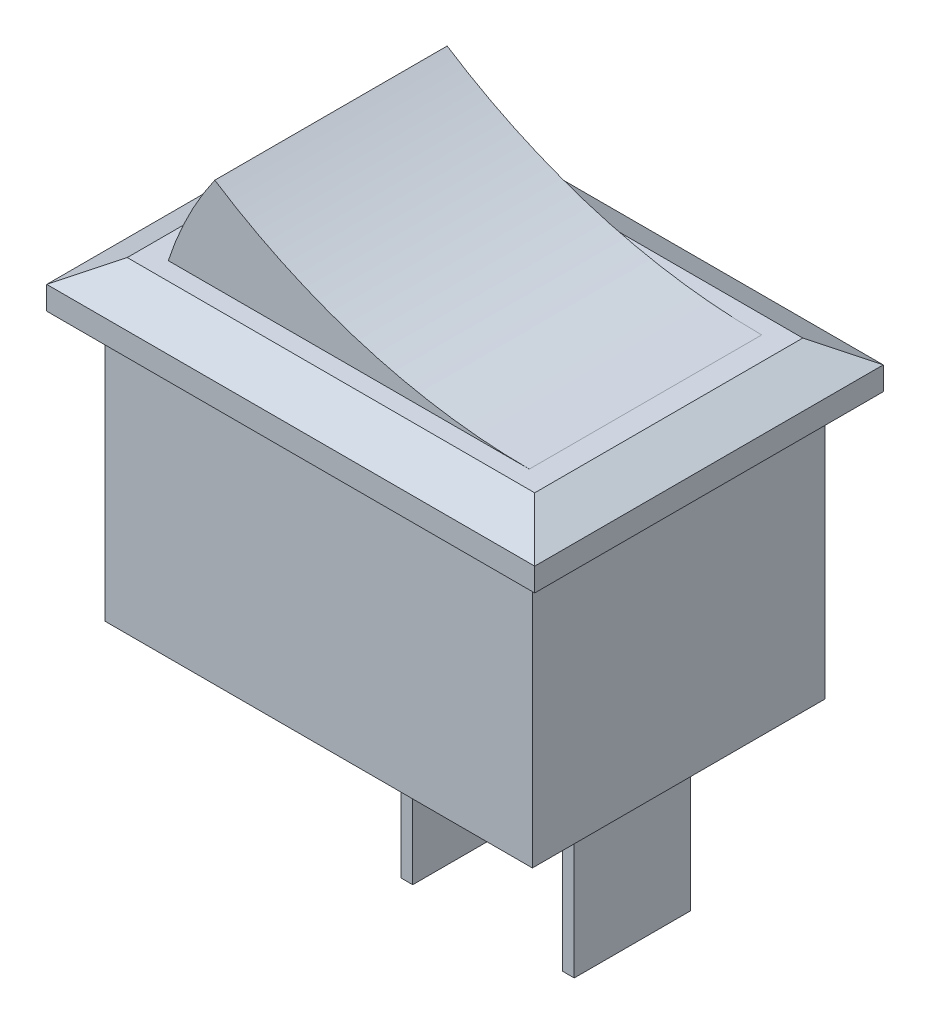
ISO-10303-21;
HEADER;
FILE_DESCRIPTION(('STEP AP214'),'2;1');
FILE_NAME('part.step','',(''),(''),'','','');
FILE_SCHEMA(('AUTOMOTIVE_DESIGN { 1 0 10303 214 1 1 1 1 }'));
ENDSEC;
DATA;
#1=APPLICATION_CONTEXT('core data for automotive mechanical design processes');
#2=APPLICATION_PROTOCOL_DEFINITION('international standard','automotive_design',2000,#1);
#3=PRODUCT_CONTEXT('',#1,'mechanical');
#4=PRODUCT('Part','Part','',(#3));
#5=PRODUCT_RELATED_PRODUCT_CATEGORY('part','',(#4));
#6=PRODUCT_DEFINITION_FORMATION('','',#4);
#7=PRODUCT_DEFINITION_CONTEXT('part definition',#1,'design');
#8=PRODUCT_DEFINITION('design','',#6,#7);
#9=PRODUCT_DEFINITION_SHAPE('','',#8);
#10=(LENGTH_UNIT() NAMED_UNIT(*) SI_UNIT(.MILLI.,.METRE.));
#11=(NAMED_UNIT(*) PLANE_ANGLE_UNIT() SI_UNIT($,.RADIAN.));
#12=(NAMED_UNIT(*) SI_UNIT($,.STERADIAN.) SOLID_ANGLE_UNIT());
#13=UNCERTAINTY_MEASURE_WITH_UNIT(LENGTH_MEASURE(1.E-05),#10,'distance_accuracy_value','');
#14=(GEOMETRIC_REPRESENTATION_CONTEXT(3) GLOBAL_UNCERTAINTY_ASSIGNED_CONTEXT((#13)) GLOBAL_UNIT_ASSIGNED_CONTEXT((#10,
#11,#12)) REPRESENTATION_CONTEXT('',''));
#15=CARTESIAN_POINT('',(0.,0.,0.));
#16=DIRECTION('',(0.,0.,1.));
#17=DIRECTION('',(1.,0.,0.));
#18=AXIS2_PLACEMENT_3D('',#15,#16,#17);
#19=CARTESIAN_POINT('',(6.7,-18.5,2.5));
#20=DIRECTION('',(1.,0.,0.));
#21=DIRECTION('',(0.,0.,-1.));
#22=AXIS2_PLACEMENT_3D('',#19,#20,#21);
#23=PLANE('',#22);
#24=DIRECTION('',(0.,0.,-1.));
#25=VECTOR('',#24,1.);
#26=CARTESIAN_POINT('',(6.7,-11.5,2.5));
#27=LINE('',#26,#25);
#28=CARTESIAN_POINT('',(6.7,-11.5,2.5));
#29=VERTEX_POINT('',#28);
#30=CARTESIAN_POINT('',(6.7,-11.5,-2.5));
#31=VERTEX_POINT('',#30);
#32=EDGE_CURVE('E12',#29,#31,#27,.T.);
#33=ORIENTED_EDGE('',*,*,#32,.T.);
#34=DIRECTION('',(0.,1.,0.));
#35=VECTOR('',#34,1.);
#36=CARTESIAN_POINT('',(6.7,-18.5,-2.5));
#37=LINE('',#36,#35);
#38=CARTESIAN_POINT('',(6.7,-18.5,-2.5));
#39=VERTEX_POINT('',#38);
#40=EDGE_CURVE('E128',#39,#31,#37,.T.);
#41=ORIENTED_EDGE('',*,*,#40,.F.);
#42=DIRECTION('',(0.,0.,-1.));
#43=VECTOR('',#42,1.);
#44=CARTESIAN_POINT('',(6.7,-18.5,2.5));
#45=LINE('',#44,#43);
#46=CARTESIAN_POINT('',(6.7,-18.5,2.5));
#47=VERTEX_POINT('',#46);
#48=EDGE_CURVE('E61',#47,#39,#45,.T.);
#49=ORIENTED_EDGE('',*,*,#48,.F.);
#50=DIRECTION('',(0.,1.,0.));
#51=VECTOR('',#50,1.);
#52=CARTESIAN_POINT('',(6.7,-18.5,2.5));
#53=LINE('',#52,#51);
#54=EDGE_CURVE('E116',#47,#29,#53,.T.);
#55=ORIENTED_EDGE('',*,*,#54,.T.);
#56=EDGE_LOOP('',(#33,#41,#49,#55));
#57=FACE_BOUND('',#56,.T.);
#58=ADVANCED_FACE('F57',(#57),#23,.F.);
#59=CARTESIAN_POINT('',(6.7,-18.5,-2.5));
#60=DIRECTION('',(0.,0.,1.));
#61=DIRECTION('',(1.,0.,0.));
#62=AXIS2_PLACEMENT_3D('',#59,#60,#61);
#63=PLANE('',#62);
#64=DIRECTION('',(1.,0.,0.));
#65=VECTOR('',#64,1.);
#66=CARTESIAN_POINT('',(6.7,-11.5,-2.5));
#67=LINE('',#66,#65);
#68=CARTESIAN_POINT('',(7.2,-11.5,-2.5));
#69=VERTEX_POINT('',#68);
#70=EDGE_CURVE('E67',#31,#69,#67,.T.);
#71=ORIENTED_EDGE('',*,*,#70,.T.);
#72=DIRECTION('',(0.,1.,0.));
#73=VECTOR('',#72,1.);
#74=CARTESIAN_POINT('',(7.2,-18.5,-2.5));
#75=LINE('',#74,#73);
#76=CARTESIAN_POINT('',(7.2,-18.5,-2.5));
#77=VERTEX_POINT('',#76);
#78=EDGE_CURVE('E112',#77,#69,#75,.T.);
#79=ORIENTED_EDGE('',*,*,#78,.F.);
#80=DIRECTION('',(1.,0.,0.));
#81=VECTOR('',#80,1.);
#82=CARTESIAN_POINT('',(6.7,-18.5,-2.5));
#83=LINE('',#82,#81);
#84=EDGE_CURVE('E91',#39,#77,#83,.T.);
#85=ORIENTED_EDGE('',*,*,#84,.F.);
#86=ORIENTED_EDGE('',*,*,#40,.T.);
#87=EDGE_LOOP('',(#71,#79,#85,#86));
#88=FACE_BOUND('',#87,.T.);
#89=ADVANCED_FACE('F131',(#88),#63,.F.);
#90=CARTESIAN_POINT('',(7.2,-18.5,2.5));
#91=DIRECTION('',(-1.,0.,0.));
#92=DIRECTION('',(0.,0.,1.));
#93=AXIS2_PLACEMENT_3D('',#90,#91,#92);
#94=PLANE('',#93);
#95=DIRECTION('',(0.,0.,1.));
#96=VECTOR('',#95,1.);
#97=CARTESIAN_POINT('',(7.2,-11.5,2.5));
#98=LINE('',#97,#96);
#99=CARTESIAN_POINT('',(7.2,-11.5,2.5));
#100=VERTEX_POINT('',#99);
#101=EDGE_CURVE('E107',#69,#100,#98,.T.);
#102=ORIENTED_EDGE('',*,*,#101,.T.);
#103=DIRECTION('',(0.,1.,0.));
#104=VECTOR('',#103,1.);
#105=CARTESIAN_POINT('',(7.2,-18.5,2.5));
#106=LINE('',#105,#104);
#107=CARTESIAN_POINT('',(7.2,-18.5,2.5));
#108=VERTEX_POINT('',#107);
#109=EDGE_CURVE('E110',#108,#100,#106,.T.);
#110=ORIENTED_EDGE('',*,*,#109,.F.);
#111=DIRECTION('',(0.,0.,1.));
#112=VECTOR('',#111,1.);
#113=CARTESIAN_POINT('',(7.2,-18.5,2.5));
#114=LINE('',#113,#112);
#115=EDGE_CURVE('E124',#77,#108,#114,.T.);
#116=ORIENTED_EDGE('',*,*,#115,.F.);
#117=ORIENTED_EDGE('',*,*,#78,.T.);
#118=EDGE_LOOP('',(#102,#110,#116,#117));
#119=FACE_BOUND('',#118,.T.);
#120=ADVANCED_FACE('F108',(#119),#94,.F.);
#121=CARTESIAN_POINT('',(6.7,-18.5,2.5));
#122=DIRECTION('',(0.,0.,-1.));
#123=DIRECTION('',(-1.,0.,0.));
#124=AXIS2_PLACEMENT_3D('',#121,#122,#123);
#125=PLANE('',#124);
#126=DIRECTION('',(-1.,0.,0.));
#127=VECTOR('',#126,1.);
#128=CARTESIAN_POINT('',(6.7,-11.5,2.5));
#129=LINE('',#128,#127);
#130=EDGE_CURVE('E101',#100,#29,#129,.T.);
#131=ORIENTED_EDGE('',*,*,#130,.T.);
#132=ORIENTED_EDGE('',*,*,#54,.F.);
#133=DIRECTION('',(-1.,0.,0.));
#134=VECTOR('',#133,1.);
#135=CARTESIAN_POINT('',(6.7,-18.5,2.5));
#136=LINE('',#135,#134);
#137=EDGE_CURVE('E115',#108,#47,#136,.T.);
#138=ORIENTED_EDGE('',*,*,#137,.F.);
#139=ORIENTED_EDGE('',*,*,#109,.T.);
#140=EDGE_LOOP('',(#131,#132,#138,#139));
#141=FACE_BOUND('',#140,.T.);
#142=ADVANCED_FACE('F114',(#141),#125,.F.);
#143=CARTESIAN_POINT('',(0.,-18.5,0.));
#144=DIRECTION('',(0.,-1.,0.));
#145=DIRECTION('',(0.,0.,-1.));
#146=AXIS2_PLACEMENT_3D('',#143,#144,#145);
#147=PLANE('',#146);
#148=ORIENTED_EDGE('',*,*,#48,.T.);
#149=ORIENTED_EDGE('',*,*,#84,.T.);
#150=ORIENTED_EDGE('',*,*,#115,.T.);
#151=ORIENTED_EDGE('',*,*,#137,.T.);
#152=EDGE_LOOP('',(#148,#149,#150,#151));
#153=FACE_BOUND('',#152,.T.);
#154=ADVANCED_FACE('F59',(#153),#147,.T.);
#155=CARTESIAN_POINT('',(0.,-11.5,0.));
#156=DIRECTION('',(0.,-1.,0.));
#157=DIRECTION('',(0.,0.,-1.));
#158=AXIS2_PLACEMENT_3D('',#155,#156,#157);
#159=PLANE('',#158);
#160=ORIENTED_EDGE('',*,*,#32,.F.);
#161=ORIENTED_EDGE('',*,*,#130,.F.);
#162=ORIENTED_EDGE('',*,*,#101,.F.);
#163=ORIENTED_EDGE('',*,*,#70,.F.);
#164=EDGE_LOOP('',(#160,#161,#162,#163));
#165=FACE_BOUND('',#164,.T.);
#166=ADVANCED_FACE('F118',(#165),#159,.F.);
#167=CLOSED_SHELL('',(#58,#89,#120,#142,#154,#166));
#168=MANIFOLD_SOLID_BREP('B2',#167);
#169=CARTESIAN_POINT('',(0.25,-18.5,-2.5));
#170=DIRECTION('',(-1.,0.,0.));
#171=DIRECTION('',(0.,0.,1.));
#172=AXIS2_PLACEMENT_3D('',#169,#170,#171);
#173=PLANE('',#172);
#174=DIRECTION('',(0.,0.,1.));
#175=VECTOR('',#174,1.);
#176=CARTESIAN_POINT('',(0.25,-11.5,-2.5));
#177=LINE('',#176,#175);
#178=CARTESIAN_POINT('',(0.25,-11.5,-2.5));
#179=VERTEX_POINT('',#178);
#180=CARTESIAN_POINT('',(0.25,-11.5,2.5));
#181=VERTEX_POINT('',#180);
#182=EDGE_CURVE('E265',#179,#181,#177,.T.);
#183=ORIENTED_EDGE('',*,*,#182,.T.);
#184=DIRECTION('',(0.,1.,0.));
#185=VECTOR('',#184,1.);
#186=CARTESIAN_POINT('',(0.25,-18.5,2.5));
#187=LINE('',#186,#185);
#188=CARTESIAN_POINT('',(0.25,-18.5,2.5));
#189=VERTEX_POINT('',#188);
#190=EDGE_CURVE('E55',#189,#181,#187,.T.);
#191=ORIENTED_EDGE('',*,*,#190,.F.);
#192=DIRECTION('',(0.,0.,1.));
#193=VECTOR('',#192,1.);
#194=CARTESIAN_POINT('',(0.25,-18.5,-2.5));
#195=LINE('',#194,#193);
#196=CARTESIAN_POINT('',(0.25,-18.5,-2.5));
#197=VERTEX_POINT('',#196);
#198=EDGE_CURVE('E253',#197,#189,#195,.T.);
#199=ORIENTED_EDGE('',*,*,#198,.F.);
#200=DIRECTION('',(0.,1.,0.));
#201=VECTOR('',#200,1.);
#202=CARTESIAN_POINT('',(0.25,-18.5,-2.5));
#203=LINE('',#202,#201);
#204=EDGE_CURVE('E261',#197,#179,#203,.T.);
#205=ORIENTED_EDGE('',*,*,#204,.T.);
#206=EDGE_LOOP('',(#183,#191,#199,#205));
#207=FACE_BOUND('',#206,.T.);
#208=ADVANCED_FACE('F202',(#207),#173,.F.);
#209=CARTESIAN_POINT('',(0.25,-18.5,2.5));
#210=DIRECTION('',(0.,0.,-1.));
#211=DIRECTION('',(-1.,0.,0.));
#212=AXIS2_PLACEMENT_3D('',#209,#210,#211);
#213=PLANE('',#212);
#214=DIRECTION('',(-1.,0.,0.));
#215=VECTOR('',#214,1.);
#216=CARTESIAN_POINT('',(0.25,-11.5,2.5));
#217=LINE('',#216,#215);
#218=CARTESIAN_POINT('',(-0.25,-11.5,2.5));
#219=VERTEX_POINT('',#218);
#220=EDGE_CURVE('E257',#181,#219,#217,.T.);
#221=ORIENTED_EDGE('',*,*,#220,.T.);
#222=DIRECTION('',(0.,1.,0.));
#223=VECTOR('',#222,1.);
#224=CARTESIAN_POINT('',(-0.25,-18.5,2.5));
#225=LINE('',#224,#223);
#226=CARTESIAN_POINT('',(-0.25,-18.5,2.5));
#227=VERTEX_POINT('',#226);
#228=EDGE_CURVE('E210',#227,#219,#225,.T.);
#229=ORIENTED_EDGE('',*,*,#228,.F.);
#230=DIRECTION('',(-1.,0.,0.));
#231=VECTOR('',#230,1.);
#232=CARTESIAN_POINT('',(0.25,-18.5,2.5));
#233=LINE('',#232,#231);
#234=EDGE_CURVE('E248',#189,#227,#233,.T.);
#235=ORIENTED_EDGE('',*,*,#234,.F.);
#236=ORIENTED_EDGE('',*,*,#190,.T.);
#237=EDGE_LOOP('',(#221,#229,#235,#236));
#238=FACE_BOUND('',#237,.T.);
#239=ADVANCED_FACE('F256',(#238),#213,.F.);
#240=CARTESIAN_POINT('',(-0.25,-18.5,-2.5));
#241=DIRECTION('',(1.,0.,0.));
#242=DIRECTION('',(0.,0.,-1.));
#243=AXIS2_PLACEMENT_3D('',#240,#241,#242);
#244=PLANE('',#243);
#245=DIRECTION('',(0.,0.,-1.));
#246=VECTOR('',#245,1.);
#247=CARTESIAN_POINT('',(-0.25,-11.5,-2.5));
#248=LINE('',#247,#246);
#249=CARTESIAN_POINT('',(-0.25,-11.5,-2.5));
#250=VERTEX_POINT('',#249);
#251=EDGE_CURVE('E235',#219,#250,#248,.T.);
#252=ORIENTED_EDGE('',*,*,#251,.T.);
#253=DIRECTION('',(0.,1.,0.));
#254=VECTOR('',#253,1.);
#255=CARTESIAN_POINT('',(-0.25,-18.5,-2.5));
#256=LINE('',#255,#254);
#257=CARTESIAN_POINT('',(-0.25,-18.5,-2.5));
#258=VERTEX_POINT('',#257);
#259=EDGE_CURVE('E258',#258,#250,#256,.T.);
#260=ORIENTED_EDGE('',*,*,#259,.F.);
#261=DIRECTION('',(0.,0.,-1.));
#262=VECTOR('',#261,1.);
#263=CARTESIAN_POINT('',(-0.25,-18.5,-2.5));
#264=LINE('',#263,#262);
#265=EDGE_CURVE('E251',#227,#258,#264,.T.);
#266=ORIENTED_EDGE('',*,*,#265,.F.);
#267=ORIENTED_EDGE('',*,*,#228,.T.);
#268=EDGE_LOOP('',(#252,#260,#266,#267));
#269=FACE_BOUND('',#268,.T.);
#270=ADVANCED_FACE('F259',(#269),#244,.F.);
#271=CARTESIAN_POINT('',(0.25,-18.5,-2.5));
#272=DIRECTION('',(0.,0.,1.));
#273=DIRECTION('',(1.,0.,0.));
#274=AXIS2_PLACEMENT_3D('',#271,#272,#273);
#275=PLANE('',#274);
#276=DIRECTION('',(1.,0.,0.));
#277=VECTOR('',#276,1.);
#278=CARTESIAN_POINT('',(0.25,-11.5,-2.5));
#279=LINE('',#278,#277);
#280=EDGE_CURVE('E241',#250,#179,#279,.T.);
#281=ORIENTED_EDGE('',*,*,#280,.T.);
#282=ORIENTED_EDGE('',*,*,#204,.F.);
#283=DIRECTION('',(1.,0.,0.));
#284=VECTOR('',#283,1.);
#285=CARTESIAN_POINT('',(0.25,-18.5,-2.5));
#286=LINE('',#285,#284);
#287=EDGE_CURVE('E218',#258,#197,#286,.T.);
#288=ORIENTED_EDGE('',*,*,#287,.F.);
#289=ORIENTED_EDGE('',*,*,#259,.T.);
#290=EDGE_LOOP('',(#281,#282,#288,#289));
#291=FACE_BOUND('',#290,.T.);
#292=ADVANCED_FACE('F272',(#291),#275,.F.);
#293=CARTESIAN_POINT('',(0.,-18.5,0.));
#294=DIRECTION('',(0.,-1.,0.));
#295=DIRECTION('',(0.,0.,-1.));
#296=AXIS2_PLACEMENT_3D('',#293,#294,#295);
#297=PLANE('',#296);
#298=ORIENTED_EDGE('',*,*,#198,.T.);
#299=ORIENTED_EDGE('',*,*,#234,.T.);
#300=ORIENTED_EDGE('',*,*,#265,.T.);
#301=ORIENTED_EDGE('',*,*,#287,.T.);
#302=EDGE_LOOP('',(#298,#299,#300,#301));
#303=FACE_BOUND('',#302,.T.);
#304=ADVANCED_FACE('F249',(#303),#297,.T.);
#305=CARTESIAN_POINT('',(0.,-11.5,0.));
#306=DIRECTION('',(0.,-1.,0.));
#307=DIRECTION('',(0.,0.,-1.));
#308=AXIS2_PLACEMENT_3D('',#305,#306,#307);
#309=PLANE('',#308);
#310=ORIENTED_EDGE('',*,*,#182,.F.);
#311=ORIENTED_EDGE('',*,*,#280,.F.);
#312=ORIENTED_EDGE('',*,*,#251,.F.);
#313=ORIENTED_EDGE('',*,*,#220,.F.);
#314=EDGE_LOOP('',(#310,#311,#312,#313));
#315=FACE_BOUND('',#314,.T.);
#316=ADVANCED_FACE('F275',(#315),#309,.F.);
#317=CLOSED_SHELL('',(#208,#239,#270,#292,#304,#316));
#318=MANIFOLD_SOLID_BREP('B6',#317);
#319=CARTESIAN_POINT('',(7.76794919243113,26.9025681356646,5.));
#320=DIRECTION('',(0.,0.,-1.));
#321=DIRECTION('',(-1.,0.,0.));
#322=AXIS2_PLACEMENT_3D('',#319,#320,#321);
#323=CYLINDRICAL_SURFACE('',#322,24.9025681356646);
#324=CARTESIAN_POINT('',(7.76794919243113,26.9025681356646,-5.));
#325=DIRECTION('',(0.,0.,-1.));
#326=DIRECTION('',(-1.,0.,0.));
#327=AXIS2_PLACEMENT_3D('',#324,#325,#326);
#328=CIRCLE('',#327,24.9025681356646);
#329=CARTESIAN_POINT('',(7.76794919243113,2.,-5.));
#330=VERTEX_POINT('',#329);
#331=CARTESIAN_POINT('',(-5.76794919243112,6.,-5.));
#332=VERTEX_POINT('',#331);
#333=EDGE_CURVE('E393',#330,#332,#328,.T.);
#334=ORIENTED_EDGE('',*,*,#333,.T.);
#335=DIRECTION('',(0.,0.,-1.));
#336=VECTOR('',#335,1.);
#337=CARTESIAN_POINT('',(-5.76794919243112,6.,5.));
#338=LINE('',#337,#336);
#339=CARTESIAN_POINT('',(-5.76794919243112,6.,5.));
#340=VERTEX_POINT('',#339);
#341=EDGE_CURVE('E200',#340,#332,#338,.T.);
#342=ORIENTED_EDGE('',*,*,#341,.F.);
#343=CARTESIAN_POINT('',(7.76794919243113,26.9025681356646,5.));
#344=DIRECTION('',(0.,0.,-1.));
#345=DIRECTION('',(-1.,0.,0.));
#346=AXIS2_PLACEMENT_3D('',#343,#344,#345);
#347=CIRCLE('',#346,24.9025681356646);
#348=CARTESIAN_POINT('',(7.76794919243113,2.,5.));
#349=VERTEX_POINT('',#348);
#350=EDGE_CURVE('E386',#349,#340,#347,.T.);
#351=ORIENTED_EDGE('',*,*,#350,.F.);
#352=DIRECTION('',(0.,0.,-1.));
#353=VECTOR('',#352,1.);
#354=CARTESIAN_POINT('',(7.76794919243113,2.,5.));
#355=LINE('',#354,#353);
#356=EDGE_CURVE('E394',#349,#330,#355,.T.);
#357=ORIENTED_EDGE('',*,*,#356,.T.);
#358=EDGE_LOOP('',(#334,#342,#351,#357));
#359=FACE_BOUND('',#358,.T.);
#360=ADVANCED_FACE('F346',(#359),#323,.F.);
#361=CARTESIAN_POINT('',(6.49854996899047,-2.6332495807108,5.));
#362=DIRECTION('',(0.,0.,-1.));
#363=DIRECTION('',(-1.,0.,0.));
#364=AXIS2_PLACEMENT_3D('',#361,#362,#363);
#365=CYLINDRICAL_SURFACE('',#364,15.);
#366=CARTESIAN_POINT('',(6.49854996899047,-2.6332495807108,-5.));
#367=DIRECTION('',(0.,0.,1.));
#368=DIRECTION('',(-1.,0.,0.));
#369=AXIS2_PLACEMENT_3D('',#366,#367,#368);
#370=CIRCLE('',#369,15.);
#371=CARTESIAN_POINT('',(-7.76794919243113,2.,-5.));
#372=VERTEX_POINT('',#371);
#373=EDGE_CURVE('E374',#332,#372,#370,.T.);
#374=ORIENTED_EDGE('',*,*,#373,.T.);
#375=DIRECTION('',(0.,0.,-1.));
#376=VECTOR('',#375,1.);
#377=CARTESIAN_POINT('',(-7.76794919243113,2.,5.));
#378=LINE('',#377,#376);
#379=CARTESIAN_POINT('',(-7.76794919243113,2.,5.));
#380=VERTEX_POINT('',#379);
#381=EDGE_CURVE('E354',#380,#372,#378,.T.);
#382=ORIENTED_EDGE('',*,*,#381,.F.);
#383=CARTESIAN_POINT('',(6.49854996899047,-2.6332495807108,5.));
#384=DIRECTION('',(0.,0.,1.));
#385=DIRECTION('',(-1.,0.,0.));
#386=AXIS2_PLACEMENT_3D('',#383,#384,#385);
#387=CIRCLE('',#386,15.);
#388=EDGE_CURVE('E382',#340,#380,#387,.T.);
#389=ORIENTED_EDGE('',*,*,#388,.F.);
#390=ORIENTED_EDGE('',*,*,#341,.T.);
#391=EDGE_LOOP('',(#374,#382,#389,#390));
#392=FACE_BOUND('',#391,.T.);
#393=ADVANCED_FACE('F383',(#392),#365,.T.);
#394=CARTESIAN_POINT('',(-7.76794919243113,2.,5.));
#395=DIRECTION('',(0.,1.,0.));
#396=DIRECTION('',(0.,0.,1.));
#397=AXIS2_PLACEMENT_3D('',#394,#395,#396);
#398=PLANE('',#397);
#399=DIRECTION('',(1.,0.,0.));
#400=VECTOR('',#399,1.);
#401=CARTESIAN_POINT('',(-7.76794919243113,2.,-5.));
#402=LINE('',#401,#400);
#403=EDGE_CURVE('E379',#372,#330,#402,.T.);
#404=ORIENTED_EDGE('',*,*,#403,.T.);
#405=ORIENTED_EDGE('',*,*,#356,.F.);
#406=DIRECTION('',(1.,0.,0.));
#407=VECTOR('',#406,1.);
#408=CARTESIAN_POINT('',(-7.76794919243113,2.,5.));
#409=LINE('',#408,#407);
#410=EDGE_CURVE('E362',#380,#349,#409,.T.);
#411=ORIENTED_EDGE('',*,*,#410,.F.);
#412=ORIENTED_EDGE('',*,*,#381,.T.);
#413=EDGE_LOOP('',(#404,#405,#411,#412));
#414=FACE_BOUND('',#413,.T.);
#415=ADVANCED_FACE('F401',(#414),#398,.F.);
#416=CARTESIAN_POINT('',(7.76794919243113,26.9025681356646,5.));
#417=DIRECTION('',(0.,0.,-1.));
#418=DIRECTION('',(-1.,0.,0.));
#419=AXIS2_PLACEMENT_3D('',#416,#417,#418);
#420=PLANE('',#419);
#421=ORIENTED_EDGE('',*,*,#350,.T.);
#422=ORIENTED_EDGE('',*,*,#388,.T.);
#423=ORIENTED_EDGE('',*,*,#410,.T.);
#424=EDGE_LOOP('',(#421,#422,#423));
#425=FACE_BOUND('',#424,.T.);
#426=ADVANCED_FACE('F389',(#425),#420,.F.);
#427=CARTESIAN_POINT('',(7.76794919243113,26.9025681356646,-5.));
#428=DIRECTION('',(0.,0.,-1.));
#429=DIRECTION('',(-1.,0.,0.));
#430=AXIS2_PLACEMENT_3D('',#427,#428,#429);
#431=PLANE('',#430);
#432=ORIENTED_EDGE('',*,*,#333,.F.);
#433=ORIENTED_EDGE('',*,*,#403,.F.);
#434=ORIENTED_EDGE('',*,*,#373,.F.);
#435=EDGE_LOOP('',(#432,#433,#434));
#436=FACE_BOUND('',#435,.T.);
#437=ADVANCED_FACE('F402',(#436),#431,.T.);
#438=CLOSED_SHELL('',(#360,#393,#415,#426,#437));
#439=MANIFOLD_SOLID_BREP('B49',#438);
#440=CARTESIAN_POINT('',(-10.5,2.,7.5));
#441=DIRECTION('',(1.,0.,0.));
#442=DIRECTION('',(0.,0.,-1.));
#443=AXIS2_PLACEMENT_3D('',#440,#441,#442);
#444=PLANE('',#443);
#445=DIRECTION('',(0.,-1.,0.));
#446=VECTOR('',#445,1.);
#447=CARTESIAN_POINT('',(-10.5,2.,7.5));
#448=LINE('',#447,#446);
#449=CARTESIAN_POINT('',(-10.5,0.999999999999999,7.5));
#450=VERTEX_POINT('',#449);
#451=CARTESIAN_POINT('',(-10.5,0.,7.5));
#452=VERTEX_POINT('',#451);
#453=EDGE_CURVE('E592',#450,#452,#448,.T.);
#454=ORIENTED_EDGE('',*,*,#453,.F.);
#455=DIRECTION('',(0.,0.,-1.));
#456=VECTOR('',#455,1.);
#457=CARTESIAN_POINT('',(-10.5,0.999999999999999,7.5));
#458=LINE('',#457,#456);
#459=CARTESIAN_POINT('',(-10.5,0.999999999999999,-7.5));
#460=VERTEX_POINT('',#459);
#461=EDGE_CURVE('E344',#450,#460,#458,.T.);
#462=ORIENTED_EDGE('',*,*,#461,.T.);
#463=DIRECTION('',(0.,-1.,0.));
#464=VECTOR('',#463,1.);
#465=CARTESIAN_POINT('',(-10.5,2.,-7.5));
#466=LINE('',#465,#464);
#467=CARTESIAN_POINT('',(-10.5,0.,-7.5));
#468=VERTEX_POINT('',#467);
#469=EDGE_CURVE('E583',#460,#468,#466,.T.);
#470=ORIENTED_EDGE('',*,*,#469,.T.);
#471=DIRECTION('',(0.,0.,1.));
#472=VECTOR('',#471,1.);
#473=CARTESIAN_POINT('',(-10.5,0.,7.5));
#474=LINE('',#473,#472);
#475=EDGE_CURVE('E567',#468,#452,#474,.T.);
#476=ORIENTED_EDGE('',*,*,#475,.T.);
#477=EDGE_LOOP('',(#454,#462,#470,#476));
#478=FACE_BOUND('',#477,.T.);
#479=ADVANCED_FACE('F454',(#478),#444,.F.);
#480=CARTESIAN_POINT('',(-10.5,2.,7.5));
#481=DIRECTION('',(0.,0.,-1.));
#482=DIRECTION('',(-1.,0.,0.));
#483=AXIS2_PLACEMENT_3D('',#480,#481,#482);
#484=PLANE('',#483);
#485=DIRECTION('',(0.,-1.,0.));
#486=VECTOR('',#485,1.);
#487=CARTESIAN_POINT('',(10.5,2.,7.5));
#488=LINE('',#487,#486);
#489=CARTESIAN_POINT('',(10.5,0.999999999999999,7.5));
#490=VERTEX_POINT('',#489);
#491=CARTESIAN_POINT('',(10.5,0.,7.5));
#492=VERTEX_POINT('',#491);
#493=EDGE_CURVE('E589',#490,#492,#488,.T.);
#494=ORIENTED_EDGE('',*,*,#493,.F.);
#495=DIRECTION('',(-1.,0.,0.));
#496=VECTOR('',#495,1.);
#497=CARTESIAN_POINT('',(-10.5,0.999999999999999,7.5));
#498=LINE('',#497,#496);
#499=EDGE_CURVE('E465',#490,#450,#498,.T.);
#500=ORIENTED_EDGE('',*,*,#499,.T.);
#501=ORIENTED_EDGE('',*,*,#453,.T.);
#502=DIRECTION('',(1.,0.,0.));
#503=VECTOR('',#502,1.);
#504=CARTESIAN_POINT('',(-10.5,0.,7.5));
#505=LINE('',#504,#503);
#506=EDGE_CURVE('E571',#452,#492,#505,.T.);
#507=ORIENTED_EDGE('',*,*,#506,.T.);
#508=EDGE_LOOP('',(#494,#500,#501,#507));
#509=FACE_BOUND('',#508,.T.);
#510=ADVANCED_FACE('F639',(#509),#484,.F.);
#511=CARTESIAN_POINT('',(10.5,2.,7.5));
#512=DIRECTION('',(-1.,0.,0.));
#513=DIRECTION('',(0.,0.,1.));
#514=AXIS2_PLACEMENT_3D('',#511,#512,#513);
#515=PLANE('',#514);
#516=DIRECTION('',(0.,-1.,0.));
#517=VECTOR('',#516,1.);
#518=CARTESIAN_POINT('',(10.5,2.,-7.5));
#519=LINE('',#518,#517);
#520=CARTESIAN_POINT('',(10.5,0.999999999999999,-7.5));
#521=VERTEX_POINT('',#520);
#522=CARTESIAN_POINT('',(10.5,0.,-7.5));
#523=VERTEX_POINT('',#522);
#524=EDGE_CURVE('E586',#521,#523,#519,.T.);
#525=ORIENTED_EDGE('',*,*,#524,.F.);
#526=DIRECTION('',(0.,0.,1.));
#527=VECTOR('',#526,1.);
#528=CARTESIAN_POINT('',(10.5,0.999999999999999,7.5));
#529=LINE('',#528,#527);
#530=EDGE_CURVE('E612',#521,#490,#529,.T.);
#531=ORIENTED_EDGE('',*,*,#530,.T.);
#532=ORIENTED_EDGE('',*,*,#493,.T.);
#533=DIRECTION('',(0.,0.,-1.));
#534=VECTOR('',#533,1.);
#535=CARTESIAN_POINT('',(10.5,0.,7.5));
#536=LINE('',#535,#534);
#537=EDGE_CURVE('E575',#492,#523,#536,.T.);
#538=ORIENTED_EDGE('',*,*,#537,.T.);
#539=EDGE_LOOP('',(#525,#531,#532,#538));
#540=FACE_BOUND('',#539,.T.);
#541=ADVANCED_FACE('F650',(#540),#515,.F.);
#542=CARTESIAN_POINT('',(-10.5,2.,-7.5));
#543=DIRECTION('',(0.,0.,1.));
#544=DIRECTION('',(1.,0.,0.));
#545=AXIS2_PLACEMENT_3D('',#542,#543,#544);
#546=PLANE('',#545);
#547=ORIENTED_EDGE('',*,*,#469,.F.);
#548=DIRECTION('',(1.,0.,0.));
#549=VECTOR('',#548,1.);
#550=CARTESIAN_POINT('',(-10.5,0.999999999999999,-7.5));
#551=LINE('',#550,#549);
#552=EDGE_CURVE('E608',#460,#521,#551,.T.);
#553=ORIENTED_EDGE('',*,*,#552,.T.);
#554=ORIENTED_EDGE('',*,*,#524,.T.);
#555=DIRECTION('',(-1.,0.,0.));
#556=VECTOR('',#555,1.);
#557=CARTESIAN_POINT('',(-10.5,0.,-7.5));
#558=LINE('',#557,#556);
#559=EDGE_CURVE('E579',#523,#468,#558,.T.);
#560=ORIENTED_EDGE('',*,*,#559,.T.);
#561=EDGE_LOOP('',(#547,#553,#554,#560));
#562=FACE_BOUND('',#561,.T.);
#563=ADVANCED_FACE('F652',(#562),#546,.F.);
#564=CARTESIAN_POINT('',(0.,2.,0.));
#565=DIRECTION('',(0.,-1.,0.));
#566=DIRECTION('',(0.,0.,-1.));
#567=AXIS2_PLACEMENT_3D('',#564,#565,#566);
#568=PLANE('',#567);
#569=DIRECTION('',(0.,0.,-1.));
#570=VECTOR('',#569,1.);
#571=CARTESIAN_POINT('',(8.76794919243113,2.,0.));
#572=LINE('',#571,#570);
#573=CARTESIAN_POINT('',(8.76794919243113,2.,5.76794919243112));
#574=VERTEX_POINT('',#573);
#575=CARTESIAN_POINT('',(8.76794919243113,2.,-5.76794919243112));
#576=VERTEX_POINT('',#575);
#577=EDGE_CURVE('E601',#574,#576,#572,.T.);
#578=ORIENTED_EDGE('',*,*,#577,.T.);
#579=DIRECTION('',(-1.,0.,0.));
#580=VECTOR('',#579,1.);
#581=CARTESIAN_POINT('',(0.,2.,-5.76794919243112));
#582=LINE('',#581,#580);
#583=CARTESIAN_POINT('',(-8.76794919243113,2.,-5.76794919243112));
#584=VERTEX_POINT('',#583);
#585=EDGE_CURVE('E604',#576,#584,#582,.T.);
#586=ORIENTED_EDGE('',*,*,#585,.T.);
#587=DIRECTION('',(0.,0.,1.));
#588=VECTOR('',#587,1.);
#589=CARTESIAN_POINT('',(-8.76794919243113,2.,0.));
#590=LINE('',#589,#588);
#591=CARTESIAN_POINT('',(-8.76794919243113,2.,5.76794919243112));
#592=VERTEX_POINT('',#591);
#593=EDGE_CURVE('E595',#584,#592,#590,.T.);
#594=ORIENTED_EDGE('',*,*,#593,.T.);
#595=DIRECTION('',(1.,0.,0.));
#596=VECTOR('',#595,1.);
#597=CARTESIAN_POINT('',(0.,2.,5.76794919243112));
#598=LINE('',#597,#596);
#599=EDGE_CURVE('E598',#592,#574,#598,.T.);
#600=ORIENTED_EDGE('',*,*,#599,.T.);
#601=EDGE_LOOP('',(#578,#586,#594,#600));
#602=FACE_BOUND('',#601,.T.);
#603=ADVANCED_FACE('F660',(#602),#568,.F.);
#604=CARTESIAN_POINT('',(0.,0.,0.));
#605=DIRECTION('',(0.,-1.,0.));
#606=DIRECTION('',(0.,0.,-1.));
#607=AXIS2_PLACEMENT_3D('',#604,#605,#606);
#608=PLANE('',#607);
#609=DIRECTION('',(0.,0.,-1.));
#610=VECTOR('',#609,1.);
#611=CARTESIAN_POINT('',(-9.2,0.,6.3));
#612=LINE('',#611,#610);
#613=CARTESIAN_POINT('',(-9.2,0.,6.3));
#614=VERTEX_POINT('',#613);
#615=CARTESIAN_POINT('',(-9.2,0.,-6.3));
#616=VERTEX_POINT('',#615);
#617=EDGE_CURVE('E473',#614,#616,#612,.T.);
#618=ORIENTED_EDGE('',*,*,#617,.F.);
#619=DIRECTION('',(-1.,0.,0.));
#620=VECTOR('',#619,1.);
#621=CARTESIAN_POINT('',(-9.2,0.,6.3));
#622=LINE('',#621,#620);
#623=CARTESIAN_POINT('',(9.2,0.,6.3));
#624=VERTEX_POINT('',#623);
#625=EDGE_CURVE('E477',#624,#614,#622,.T.);
#626=ORIENTED_EDGE('',*,*,#625,.F.);
#627=DIRECTION('',(0.,0.,1.));
#628=VECTOR('',#627,1.);
#629=CARTESIAN_POINT('',(9.2,0.,6.3));
#630=LINE('',#629,#628);
#631=CARTESIAN_POINT('',(9.2,0.,-6.3));
#632=VERTEX_POINT('',#631);
#633=EDGE_CURVE('E826',#632,#624,#630,.T.);
#634=ORIENTED_EDGE('',*,*,#633,.F.);
#635=DIRECTION('',(1.,0.,0.));
#636=VECTOR('',#635,1.);
#637=CARTESIAN_POINT('',(-9.2,0.,-6.3));
#638=LINE('',#637,#636);
#639=EDGE_CURVE('E836',#616,#632,#638,.T.);
#640=ORIENTED_EDGE('',*,*,#639,.F.);
#641=EDGE_LOOP('',(#618,#626,#634,#640));
#642=FACE_BOUND('',#641,.T.);
#643=ORIENTED_EDGE('',*,*,#475,.F.);
#644=ORIENTED_EDGE('',*,*,#559,.F.);
#645=ORIENTED_EDGE('',*,*,#537,.F.);
#646=ORIENTED_EDGE('',*,*,#506,.F.);
#647=EDGE_LOOP('',(#643,#644,#645,#646));
#648=FACE_BOUND('',#647,.T.);
#649=ADVANCED_FACE('F646',(#642,#648),#608,.T.);
#650=CARTESIAN_POINT('',(0.,2.,5.76794919243112));
#651=DIRECTION('',(0.,-0.866025403784438,-0.500000000000001));
#652=DIRECTION('',(1.,0.,0.));
#653=AXIS2_PLACEMENT_3D('',#650,#651,#652);
#654=PLANE('',#653);
#655=DIRECTION('',(0.654653670707977,0.377964473009228,-0.654653670707977));
#656=VECTOR('',#655,1.);
#657=CARTESIAN_POINT('',(-6.2959709671035,3.4271972938238,3.2959709671035));
#658=LINE('',#657,#656);
#659=EDGE_CURVE('E618',#450,#592,#658,.T.);
#660=ORIENTED_EDGE('',*,*,#659,.F.);
#661=ORIENTED_EDGE('',*,*,#499,.F.);
#662=DIRECTION('',(-0.654653670707977,0.377964473009228,-0.654653670707977));
#663=VECTOR('',#662,1.);
#664=CARTESIAN_POINT('',(5.01025668138922,4.16950478278189,2.01025668138922));
#665=LINE('',#664,#663);
#666=EDGE_CURVE('E459',#574,#490,#665,.F.);
#667=ORIENTED_EDGE('',*,*,#666,.F.);
#668=ORIENTED_EDGE('',*,*,#599,.F.);
#669=EDGE_LOOP('',(#660,#661,#667,#668));
#670=FACE_BOUND('',#669,.T.);
#671=ADVANCED_FACE('F457',(#670),#654,.F.);
#672=CARTESIAN_POINT('',(8.76794919243113,2.,0.));
#673=DIRECTION('',(-0.500000000000001,-0.866025403784438,0.));
#674=DIRECTION('',(0.,0.,-1.));
#675=AXIS2_PLACEMENT_3D('',#672,#673,#674);
#676=PLANE('',#675);
#677=ORIENTED_EDGE('',*,*,#666,.T.);
#678=ORIENTED_EDGE('',*,*,#530,.F.);
#679=DIRECTION('',(-0.654653670707977,0.377964473009228,0.654653670707977));
#680=VECTOR('',#679,1.);
#681=CARTESIAN_POINT('',(6.2959709671035,3.4271972938238,-3.2959709671035));
#682=LINE('',#681,#680);
#683=EDGE_CURVE('E561',#576,#521,#682,.F.);
#684=ORIENTED_EDGE('',*,*,#683,.F.);
#685=ORIENTED_EDGE('',*,*,#577,.F.);
#686=EDGE_LOOP('',(#677,#678,#684,#685));
#687=FACE_BOUND('',#686,.T.);
#688=ADVANCED_FACE('F631',(#687),#676,.F.);
#689=CARTESIAN_POINT('',(-8.76794919243113,2.,0.));
#690=DIRECTION('',(0.500000000000001,-0.866025403784438,0.));
#691=DIRECTION('',(0.,0.,1.));
#692=AXIS2_PLACEMENT_3D('',#689,#690,#691);
#693=PLANE('',#692);
#694=ORIENTED_EDGE('',*,*,#659,.T.);
#695=ORIENTED_EDGE('',*,*,#593,.F.);
#696=DIRECTION('',(-0.654653670707977,-0.377964473009228,-0.654653670707977));
#697=VECTOR('',#696,1.);
#698=CARTESIAN_POINT('',(-6.2959709671035,3.4271972938238,-3.2959709671035));
#699=LINE('',#698,#697);
#700=EDGE_CURVE('E557',#460,#584,#699,.F.);
#701=ORIENTED_EDGE('',*,*,#700,.F.);
#702=ORIENTED_EDGE('',*,*,#461,.F.);
#703=EDGE_LOOP('',(#694,#695,#701,#702));
#704=FACE_BOUND('',#703,.T.);
#705=ADVANCED_FACE('F658',(#704),#693,.F.);
#706=CARTESIAN_POINT('',(0.,2.,-5.76794919243112));
#707=DIRECTION('',(0.,-0.866025403784438,0.500000000000001));
#708=DIRECTION('',(-1.,0.,0.));
#709=AXIS2_PLACEMENT_3D('',#706,#707,#708);
#710=PLANE('',#709);
#711=ORIENTED_EDGE('',*,*,#683,.T.);
#712=ORIENTED_EDGE('',*,*,#552,.F.);
#713=ORIENTED_EDGE('',*,*,#700,.T.);
#714=ORIENTED_EDGE('',*,*,#585,.F.);
#715=EDGE_LOOP('',(#711,#712,#713,#714));
#716=FACE_BOUND('',#715,.T.);
#717=ADVANCED_FACE('F656',(#716),#710,.F.);
#718=CARTESIAN_POINT('',(-9.2,-11.5,6.3));
#719=DIRECTION('',(1.,0.,0.));
#720=DIRECTION('',(0.,0.,-1.));
#721=AXIS2_PLACEMENT_3D('',#718,#719,#720);
#722=PLANE('',#721);
#723=ORIENTED_EDGE('',*,*,#617,.T.);
#724=DIRECTION('',(0.,1.,0.));
#725=VECTOR('',#724,1.);
#726=CARTESIAN_POINT('',(-9.2,-11.5,-6.3));
#727=LINE('',#726,#725);
#728=CARTESIAN_POINT('',(-9.2,-11.5,-6.3));
#729=VERTEX_POINT('',#728);
#730=EDGE_CURVE('E537',#729,#616,#727,.T.);
#731=ORIENTED_EDGE('',*,*,#730,.F.);
#732=DIRECTION('',(0.,0.,-1.));
#733=VECTOR('',#732,1.);
#734=CARTESIAN_POINT('',(-9.2,-11.5,6.3));
#735=LINE('',#734,#733);
#736=CARTESIAN_POINT('',(-9.2,-11.5,6.3));
#737=VERTEX_POINT('',#736);
#738=EDGE_CURVE('E544',#737,#729,#735,.T.);
#739=ORIENTED_EDGE('',*,*,#738,.F.);
#740=DIRECTION('',(0.,1.,0.));
#741=VECTOR('',#740,1.);
#742=CARTESIAN_POINT('',(-9.2,-11.5,6.3));
#743=LINE('',#742,#741);
#744=EDGE_CURVE('E823',#737,#614,#743,.T.);
#745=ORIENTED_EDGE('',*,*,#744,.T.);
#746=EDGE_LOOP('',(#723,#731,#739,#745));
#747=FACE_BOUND('',#746,.T.);
#748=ADVANCED_FACE('F555',(#747),#722,.F.);
#749=CARTESIAN_POINT('',(-9.2,-11.5,-6.3));
#750=DIRECTION('',(0.,0.,1.));
#751=DIRECTION('',(1.,0.,0.));
#752=AXIS2_PLACEMENT_3D('',#749,#750,#751);
#753=PLANE('',#752);
#754=ORIENTED_EDGE('',*,*,#639,.T.);
#755=DIRECTION('',(0.,1.,0.));
#756=VECTOR('',#755,1.);
#757=CARTESIAN_POINT('',(9.2,-11.5,-6.3));
#758=LINE('',#757,#756);
#759=CARTESIAN_POINT('',(9.2,-11.5,-6.3));
#760=VERTEX_POINT('',#759);
#761=EDGE_CURVE('E539',#760,#632,#758,.T.);
#762=ORIENTED_EDGE('',*,*,#761,.F.);
#763=DIRECTION('',(1.,0.,0.));
#764=VECTOR('',#763,1.);
#765=CARTESIAN_POINT('',(-9.2,-11.5,-6.3));
#766=LINE('',#765,#764);
#767=EDGE_CURVE('E532',#729,#760,#766,.T.);
#768=ORIENTED_EDGE('',*,*,#767,.F.);
#769=ORIENTED_EDGE('',*,*,#730,.T.);
#770=EDGE_LOOP('',(#754,#762,#768,#769));
#771=FACE_BOUND('',#770,.T.);
#772=ADVANCED_FACE('F535',(#771),#753,.F.);
#773=CARTESIAN_POINT('',(9.2,-11.5,6.3));
#774=DIRECTION('',(-1.,0.,0.));
#775=DIRECTION('',(0.,0.,1.));
#776=AXIS2_PLACEMENT_3D('',#773,#774,#775);
#777=PLANE('',#776);
#778=ORIENTED_EDGE('',*,*,#633,.T.);
#779=DIRECTION('',(0.,1.,0.));
#780=VECTOR('',#779,1.);
#781=CARTESIAN_POINT('',(9.2,-11.5,6.3));
#782=LINE('',#781,#780);
#783=CARTESIAN_POINT('',(9.2,-11.5,6.3));
#784=VERTEX_POINT('',#783);
#785=EDGE_CURVE('E563',#784,#624,#782,.T.);
#786=ORIENTED_EDGE('',*,*,#785,.F.);
#787=DIRECTION('',(0.,0.,1.));
#788=VECTOR('',#787,1.);
#789=CARTESIAN_POINT('',(9.2,-11.5,6.3));
#790=LINE('',#789,#788);
#791=EDGE_CURVE('E543',#760,#784,#790,.T.);
#792=ORIENTED_EDGE('',*,*,#791,.F.);
#793=ORIENTED_EDGE('',*,*,#761,.T.);
#794=EDGE_LOOP('',(#778,#786,#792,#793));
#795=FACE_BOUND('',#794,.T.);
#796=ADVANCED_FACE('F723',(#795),#777,.F.);
#797=CARTESIAN_POINT('',(-9.2,-11.5,6.3));
#798=DIRECTION('',(0.,0.,-1.));
#799=DIRECTION('',(-1.,0.,0.));
#800=AXIS2_PLACEMENT_3D('',#797,#798,#799);
#801=PLANE('',#800);
#802=ORIENTED_EDGE('',*,*,#625,.T.);
#803=ORIENTED_EDGE('',*,*,#744,.F.);
#804=DIRECTION('',(-1.,0.,0.));
#805=VECTOR('',#804,1.);
#806=CARTESIAN_POINT('',(-9.2,-11.5,6.3));
#807=LINE('',#806,#805);
#808=EDGE_CURVE('E549',#784,#737,#807,.T.);
#809=ORIENTED_EDGE('',*,*,#808,.F.);
#810=ORIENTED_EDGE('',*,*,#785,.T.);
#811=EDGE_LOOP('',(#802,#803,#809,#810));
#812=FACE_BOUND('',#811,.T.);
#813=ADVANCED_FACE('F733',(#812),#801,.F.);
#814=CARTESIAN_POINT('',(0.,-11.5,0.));
#815=DIRECTION('',(0.,-1.,0.));
#816=DIRECTION('',(0.,0.,-1.));
#817=AXIS2_PLACEMENT_3D('',#814,#815,#816);
#818=PLANE('',#817);
#819=ORIENTED_EDGE('',*,*,#738,.T.);
#820=ORIENTED_EDGE('',*,*,#767,.T.);
#821=ORIENTED_EDGE('',*,*,#791,.T.);
#822=ORIENTED_EDGE('',*,*,#808,.T.);
#823=EDGE_LOOP('',(#819,#820,#821,#822));
#824=FACE_BOUND('',#823,.T.);
#825=ADVANCED_FACE('F547',(#824),#818,.T.);
#826=CLOSED_SHELL('',(#479,#510,#541,#563,#603,#649,#671,#688,#705,#717,#748,#772,#796,#813,#825));
#827=MANIFOLD_SOLID_BREP('B194',#826);
#828=ADVANCED_BREP_SHAPE_REPRESENTATION('',(#18,#168,#318,#439,#827),#14);
#829=SHAPE_DEFINITION_REPRESENTATION(#9,#828);
ENDSEC;
END-ISO-10303-21;
